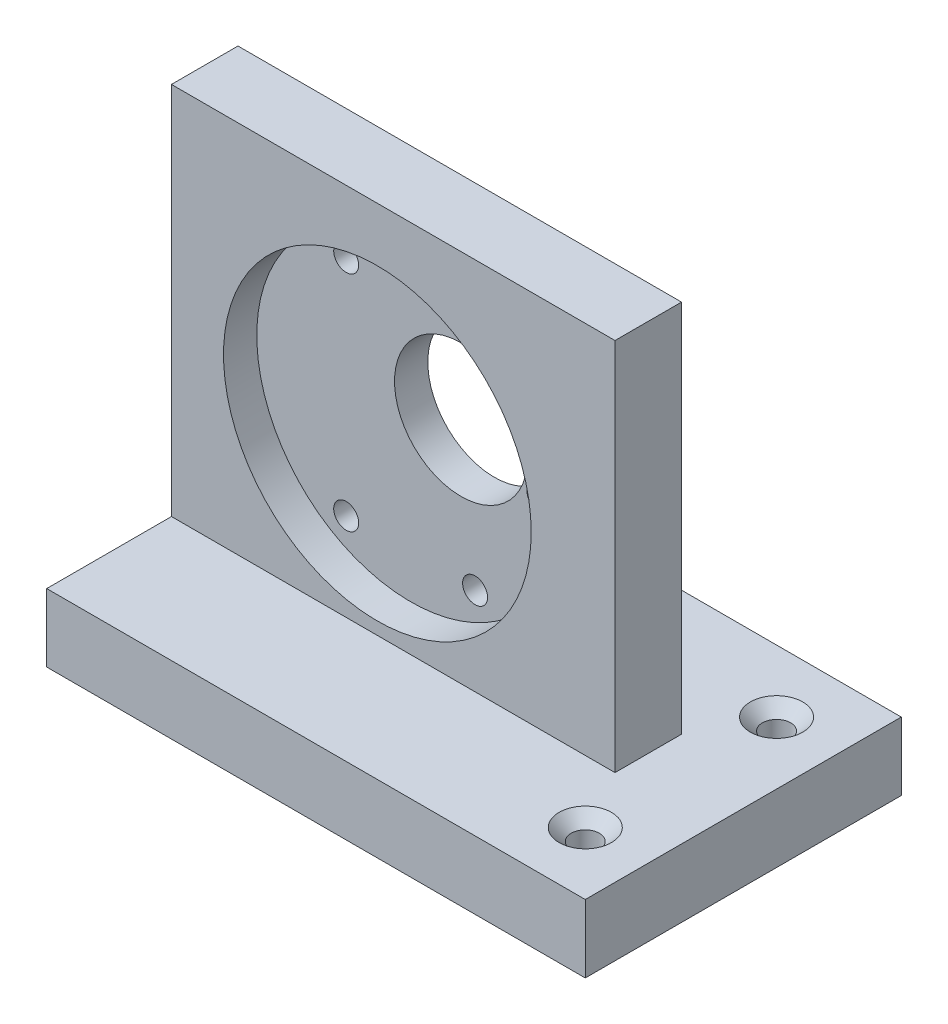
ISO-10303-21;
HEADER;
FILE_DESCRIPTION(('STEP AP214'),'2;1');
FILE_NAME('part.step','',(''),(''),'','','');
FILE_SCHEMA(('AUTOMOTIVE_DESIGN { 1 0 10303 214 1 1 1 1 }'));
ENDSEC;
DATA;
#1=APPLICATION_CONTEXT('core data for automotive mechanical design processes');
#2=APPLICATION_PROTOCOL_DEFINITION('international standard','automotive_design',2000,#1);
#3=PRODUCT_CONTEXT('',#1,'mechanical');
#4=PRODUCT('Part','Part','',(#3));
#5=PRODUCT_RELATED_PRODUCT_CATEGORY('part','',(#4));
#6=PRODUCT_DEFINITION_FORMATION('','',#4);
#7=PRODUCT_DEFINITION_CONTEXT('part definition',#1,'design');
#8=PRODUCT_DEFINITION('design','',#6,#7);
#9=PRODUCT_DEFINITION_SHAPE('','',#8);
#10=(LENGTH_UNIT() NAMED_UNIT(*) SI_UNIT(.MILLI.,.METRE.));
#11=(NAMED_UNIT(*) PLANE_ANGLE_UNIT() SI_UNIT($,.RADIAN.));
#12=(NAMED_UNIT(*) SI_UNIT($,.STERADIAN.) SOLID_ANGLE_UNIT());
#13=UNCERTAINTY_MEASURE_WITH_UNIT(LENGTH_MEASURE(1.E-05),#10,'distance_accuracy_value','');
#14=(GEOMETRIC_REPRESENTATION_CONTEXT(3) GLOBAL_UNCERTAINTY_ASSIGNED_CONTEXT((#13)) GLOBAL_UNIT_ASSIGNED_CONTEXT((#10,
#11,#12)) REPRESENTATION_CONTEXT('',''));
#15=CARTESIAN_POINT('',(0.,0.,0.));
#16=DIRECTION('',(0.,0.,1.));
#17=DIRECTION('',(1.,0.,0.));
#18=AXIS2_PLACEMENT_3D('',#15,#16,#17);
#19=CARTESIAN_POINT('',(-40.,5.,23.));
#20=DIRECTION('',(0.,-1.,0.));
#21=DIRECTION('',(1.,0.,0.));
#22=AXIS2_PLACEMENT_3D('',#19,#20,#21);
#23=PLANE('',#22);
#24=CARTESIAN_POINT('',(32.5,5.00000000000002,-7.5));
#25=DIRECTION('',(0.,1.,0.));
#26=DIRECTION('',(0.,0.,1.));
#27=AXIS2_PLACEMENT_3D('',#24,#25,#26);
#28=CIRCLE('',#27,3.15);
#29=CARTESIAN_POINT('',(32.5,5.00000000000002,-4.35));
#30=VERTEX_POINT('',#29);
#31=EDGE_CURVE('E183',#30,#30,#28,.T.);
#32=ORIENTED_EDGE('',*,*,#31,.F.);
#33=EDGE_LOOP('',(#32));
#34=FACE_BOUND('',#33,.T.);
#35=CARTESIAN_POINT('',(32.5,5.00000000000002,15.5));
#36=DIRECTION('',(0.,1.,0.));
#37=DIRECTION('',(0.,0.,1.));
#38=AXIS2_PLACEMENT_3D('',#35,#36,#37);
#39=CIRCLE('',#38,3.15);
#40=CARTESIAN_POINT('',(32.5,5.00000000000002,18.65));
#41=VERTEX_POINT('',#40);
#42=EDGE_CURVE('E175',#41,#41,#39,.T.);
#43=ORIENTED_EDGE('',*,*,#42,.F.);
#44=EDGE_LOOP('',(#43));
#45=FACE_BOUND('',#44,.T.);
#46=DIRECTION('',(0.,0.,-1.));
#47=VECTOR('',#46,1.);
#48=CARTESIAN_POINT('',(-24.76,5.,23.));
#49=LINE('',#48,#47);
#50=CARTESIAN_POINT('',(-24.76,5.00000000000002,23.));
#51=VERTEX_POINT('',#50);
#52=CARTESIAN_POINT('',(-24.76,5.,8.));
#53=VERTEX_POINT('',#52);
#54=EDGE_CURVE('E172',#51,#53,#49,.T.);
#55=ORIENTED_EDGE('',*,*,#54,.F.);
#56=DIRECTION('',(-1.,0.,0.));
#57=VECTOR('',#56,1.);
#58=CARTESIAN_POINT('',(-40.,5.,23.));
#59=LINE('',#58,#57);
#60=CARTESIAN_POINT('',(40.,5.00000000000002,23.));
#61=VERTEX_POINT('',#60);
#62=EDGE_CURVE('E123',#61,#51,#59,.T.);
#63=ORIENTED_EDGE('',*,*,#62,.F.);
#64=DIRECTION('',(0.,0.,-1.));
#65=VECTOR('',#64,1.);
#66=CARTESIAN_POINT('',(40.,5.00000000000002,23.));
#67=LINE('',#66,#65);
#68=CARTESIAN_POINT('',(40.,5.00000000000002,-15.));
#69=VERTEX_POINT('',#68);
#70=EDGE_CURVE('E204',#61,#69,#67,.T.);
#71=ORIENTED_EDGE('',*,*,#70,.T.);
#72=DIRECTION('',(-1.,0.,0.));
#73=VECTOR('',#72,1.);
#74=CARTESIAN_POINT('',(-40.,5.,-15.));
#75=LINE('',#74,#73);
#76=CARTESIAN_POINT('',(-24.76,5.00000000000002,-15.));
#77=VERTEX_POINT('',#76);
#78=EDGE_CURVE('E195',#69,#77,#75,.T.);
#79=ORIENTED_EDGE('',*,*,#78,.T.);
#80=CARTESIAN_POINT('',(-24.76,5.,0.));
#81=VERTEX_POINT('',#80);
#82=EDGE_CURVE('E168',#81,#77,#49,.T.);
#83=ORIENTED_EDGE('',*,*,#82,.F.);
#84=DIRECTION('',(-1.,0.,0.));
#85=VECTOR('',#84,1.);
#86=CARTESIAN_POINT('',(0.,5.00000000000001,0.));
#87=LINE('',#86,#85);
#88=CARTESIAN_POINT('',(28.575,5.00000000000001,0.));
#89=VERTEX_POINT('',#88);
#90=EDGE_CURVE('E12',#89,#81,#87,.T.);
#91=ORIENTED_EDGE('',*,*,#90,.F.);
#92=DIRECTION('',(0.,0.,-1.));
#93=VECTOR('',#92,1.);
#94=CARTESIAN_POINT('',(28.575,5.00000000000001,8.));
#95=LINE('',#94,#93);
#96=CARTESIAN_POINT('',(28.575,5.00000000000001,8.));
#97=VERTEX_POINT('',#96);
#98=EDGE_CURVE('E207',#97,#89,#95,.T.);
#99=ORIENTED_EDGE('',*,*,#98,.F.);
#100=DIRECTION('',(-1.,0.,0.));
#101=VECTOR('',#100,1.);
#102=CARTESIAN_POINT('',(0.,5.00000000000001,8.));
#103=LINE('',#102,#101);
#104=EDGE_CURVE('E211',#97,#53,#103,.T.);
#105=ORIENTED_EDGE('',*,*,#104,.T.);
#106=EDGE_LOOP('',(#55,#63,#71,#79,#83,#91,#99,#105));
#107=FACE_BOUND('',#106,.T.);
#108=ADVANCED_FACE('F53',(#34,#45,#107),#23,.F.);
#109=CARTESIAN_POINT('',(0.,0.,8.));
#110=DIRECTION('',(0.,0.,-1.));
#111=DIRECTION('',(-1.,0.,0.));
#112=AXIS2_PLACEMENT_3D('',#109,#110,#111);
#113=PLANE('',#112);
#114=CARTESIAN_POINT('',(0.,25.,8.));
#115=DIRECTION('',(0.,0.,1.));
#116=DIRECTION('',(1.,0.,0.));
#117=AXIS2_PLACEMENT_3D('',#114,#115,#116);
#118=CIRCLE('',#117,18.5);
#119=CARTESIAN_POINT('',(18.5,25.,8.));
#120=VERTEX_POINT('',#119);
#121=EDGE_CURVE('E215',#120,#120,#118,.T.);
#122=ORIENTED_EDGE('',*,*,#121,.F.);
#123=EDGE_LOOP('',(#122));
#124=FACE_BOUND('',#123,.T.);
#125=DIRECTION('',(0.,1.,0.));
#126=VECTOR('',#125,1.);
#127=CARTESIAN_POINT('',(-24.76,0.,8.));
#128=LINE('',#127,#126);
#129=CARTESIAN_POINT('',(-24.76,50.,8.));
#130=VERTEX_POINT('',#129);
#131=EDGE_CURVE('E171',#53,#130,#128,.T.);
#132=ORIENTED_EDGE('',*,*,#131,.F.);
#133=ORIENTED_EDGE('',*,*,#104,.F.);
#134=DIRECTION('',(0.,-1.,0.));
#135=VECTOR('',#134,1.);
#136=CARTESIAN_POINT('',(28.575,50.,8.));
#137=LINE('',#136,#135);
#138=CARTESIAN_POINT('',(28.575,50.,8.));
#139=VERTEX_POINT('',#138);
#140=EDGE_CURVE('E271',#139,#97,#137,.T.);
#141=ORIENTED_EDGE('',*,*,#140,.F.);
#142=DIRECTION('',(1.,0.,0.));
#143=VECTOR('',#142,1.);
#144=CARTESIAN_POINT('',(-28.575,50.,8.));
#145=LINE('',#144,#143);
#146=EDGE_CURVE('E69',#130,#139,#145,.T.);
#147=ORIENTED_EDGE('',*,*,#146,.F.);
#148=EDGE_LOOP('',(#132,#133,#141,#147));
#149=FACE_BOUND('',#148,.T.);
#150=ADVANCED_FACE('F302',(#124,#149),#113,.F.);
#151=CARTESIAN_POINT('',(0.,0.,0.));
#152=DIRECTION('',(0.,0.,-1.));
#153=DIRECTION('',(-1.,0.,0.));
#154=AXIS2_PLACEMENT_3D('',#151,#152,#153);
#155=PLANE('',#154);
#156=CARTESIAN_POINT('',(-7.74999999999999,38.4233937586588,0.));
#157=DIRECTION('',(0.,0.,1.));
#158=DIRECTION('',(1.,0.,0.));
#159=AXIS2_PLACEMENT_3D('',#156,#157,#158);
#160=CIRCLE('',#159,1.50000000039213);
#161=CARTESIAN_POINT('',(-6.24999999960786,38.4233937586588,0.));
#162=VERTEX_POINT('',#161);
#163=EDGE_CURVE('E249',#162,#162,#160,.T.);
#164=ORIENTED_EDGE('',*,*,#163,.T.);
#165=EDGE_LOOP('',(#164));
#166=FACE_BOUND('',#165,.T.);
#167=CARTESIAN_POINT('',(-7.74999999999999,11.5766062413412,0.));
#168=DIRECTION('',(0.,0.,1.));
#169=DIRECTION('',(1.,0.,0.));
#170=AXIS2_PLACEMENT_3D('',#167,#168,#169);
#171=CIRCLE('',#170,1.50000000039213);
#172=CARTESIAN_POINT('',(-6.24999999960786,11.5766062413412,0.));
#173=VERTEX_POINT('',#172);
#174=EDGE_CURVE('E254',#173,#173,#171,.T.);
#175=ORIENTED_EDGE('',*,*,#174,.T.);
#176=EDGE_LOOP('',(#175));
#177=FACE_BOUND('',#176,.T.);
#178=CARTESIAN_POINT('',(7.75000000000001,11.5766062413412,0.));
#179=DIRECTION('',(0.,0.,1.));
#180=DIRECTION('',(1.,0.,0.));
#181=AXIS2_PLACEMENT_3D('',#178,#179,#180);
#182=CIRCLE('',#181,1.50000000039213);
#183=CARTESIAN_POINT('',(9.25000000039214,11.5766062413412,0.));
#184=VERTEX_POINT('',#183);
#185=EDGE_CURVE('E258',#184,#184,#182,.T.);
#186=ORIENTED_EDGE('',*,*,#185,.T.);
#187=EDGE_LOOP('',(#186));
#188=FACE_BOUND('',#187,.T.);
#189=CARTESIAN_POINT('',(15.5,25.,0.));
#190=DIRECTION('',(0.,0.,1.));
#191=DIRECTION('',(1.,0.,0.));
#192=AXIS2_PLACEMENT_3D('',#189,#190,#191);
#193=CIRCLE('',#192,1.50000000039213);
#194=CARTESIAN_POINT('',(17.0000000003921,25.,0.));
#195=VERTEX_POINT('',#194);
#196=EDGE_CURVE('E248',#195,#195,#193,.T.);
#197=ORIENTED_EDGE('',*,*,#196,.T.);
#198=EDGE_LOOP('',(#197));
#199=FACE_BOUND('',#198,.T.);
#200=CARTESIAN_POINT('',(6.06217782532956,28.4999999993294,0.));
#201=DIRECTION('',(0.,0.,1.));
#202=DIRECTION('',(1.,0.,0.));
#203=AXIS2_PLACEMENT_3D('',#200,#201,#202);
#204=CIRCLE('',#203,8.00000000000001);
#205=CARTESIAN_POINT('',(14.0621778253296,28.4999999993294,0.));
#206=VERTEX_POINT('',#205);
#207=EDGE_CURVE('E244',#206,#206,#204,.T.);
#208=ORIENTED_EDGE('',*,*,#207,.T.);
#209=EDGE_LOOP('',(#208));
#210=FACE_BOUND('',#209,.T.);
#211=CARTESIAN_POINT('',(7.74999999999999,38.4233937586588,0.));
#212=DIRECTION('',(0.,0.,1.));
#213=DIRECTION('',(1.,0.,0.));
#214=AXIS2_PLACEMENT_3D('',#211,#212,#213);
#215=CIRCLE('',#214,1.50000000039214);
#216=CARTESIAN_POINT('',(9.25000000039213,38.4233937586588,0.));
#217=VERTEX_POINT('',#216);
#218=EDGE_CURVE('E253',#217,#217,#215,.T.);
#219=ORIENTED_EDGE('',*,*,#218,.T.);
#220=EDGE_LOOP('',(#219));
#221=FACE_BOUND('',#220,.T.);
#222=ORIENTED_EDGE('',*,*,#90,.T.);
#223=DIRECTION('',(0.,1.,0.));
#224=VECTOR('',#223,1.);
#225=CARTESIAN_POINT('',(-24.76,0.,0.));
#226=LINE('',#225,#224);
#227=CARTESIAN_POINT('',(-24.76,50.,0.));
#228=VERTEX_POINT('',#227);
#229=EDGE_CURVE('E127',#81,#228,#226,.T.);
#230=ORIENTED_EDGE('',*,*,#229,.T.);
#231=DIRECTION('',(1.,0.,0.));
#232=VECTOR('',#231,1.);
#233=CARTESIAN_POINT('',(-28.575,50.,0.));
#234=LINE('',#233,#232);
#235=CARTESIAN_POINT('',(28.575,50.,0.));
#236=VERTEX_POINT('',#235);
#237=EDGE_CURVE('E268',#228,#236,#234,.T.);
#238=ORIENTED_EDGE('',*,*,#237,.T.);
#239=DIRECTION('',(0.,-1.,0.));
#240=VECTOR('',#239,1.);
#241=CARTESIAN_POINT('',(28.575,50.,0.));
#242=LINE('',#241,#240);
#243=EDGE_CURVE('E272',#236,#89,#242,.T.);
#244=ORIENTED_EDGE('',*,*,#243,.T.);
#245=EDGE_LOOP('',(#222,#230,#238,#244));
#246=FACE_BOUND('',#245,.T.);
#247=ADVANCED_FACE('F305',(#166,#177,#188,#199,#210,#221,#246),#155,.T.);
#248=CARTESIAN_POINT('',(-28.575,50.,8.));
#249=DIRECTION('',(0.,1.,0.));
#250=DIRECTION('',(-1.,0.,0.));
#251=AXIS2_PLACEMENT_3D('',#248,#249,#250);
#252=PLANE('',#251);
#253=ORIENTED_EDGE('',*,*,#237,.F.);
#254=DIRECTION('',(0.,0.,-1.));
#255=VECTOR('',#254,1.);
#256=CARTESIAN_POINT('',(-24.76,50.,-15.));
#257=LINE('',#256,#255);
#258=EDGE_CURVE('E160',#130,#228,#257,.T.);
#259=ORIENTED_EDGE('',*,*,#258,.F.);
#260=ORIENTED_EDGE('',*,*,#146,.T.);
#261=DIRECTION('',(0.,0.,-1.));
#262=VECTOR('',#261,1.);
#263=CARTESIAN_POINT('',(28.575,50.,8.));
#264=LINE('',#263,#262);
#265=EDGE_CURVE('E63',#139,#236,#264,.T.);
#266=ORIENTED_EDGE('',*,*,#265,.T.);
#267=EDGE_LOOP('',(#253,#259,#260,#266));
#268=FACE_BOUND('',#267,.T.);
#269=ADVANCED_FACE('F55',(#268),#252,.T.);
#270=CARTESIAN_POINT('',(0.,0.,23.));
#271=DIRECTION('',(0.,0.,1.));
#272=DIRECTION('',(1.,0.,0.));
#273=AXIS2_PLACEMENT_3D('',#270,#271,#272);
#274=PLANE('',#273);
#275=ORIENTED_EDGE('',*,*,#62,.T.);
#276=DIRECTION('',(0.,-1.,0.));
#277=VECTOR('',#276,1.);
#278=CARTESIAN_POINT('',(-24.76,50.,23.));
#279=LINE('',#278,#277);
#280=CARTESIAN_POINT('',(-24.76,-3.175,23.));
#281=VERTEX_POINT('',#280);
#282=EDGE_CURVE('E117',#51,#281,#279,.T.);
#283=ORIENTED_EDGE('',*,*,#282,.T.);
#284=DIRECTION('',(-1.,0.,0.));
#285=VECTOR('',#284,1.);
#286=CARTESIAN_POINT('',(0.,-3.175,23.));
#287=LINE('',#286,#285);
#288=CARTESIAN_POINT('',(40.,-3.17499999999999,23.));
#289=VERTEX_POINT('',#288);
#290=EDGE_CURVE('E121',#289,#281,#287,.T.);
#291=ORIENTED_EDGE('',*,*,#290,.F.);
#292=DIRECTION('',(0.,1.,0.));
#293=VECTOR('',#292,1.);
#294=CARTESIAN_POINT('',(40.,5.00000000000002,23.));
#295=LINE('',#294,#293);
#296=EDGE_CURVE('E199',#289,#61,#295,.T.);
#297=ORIENTED_EDGE('',*,*,#296,.T.);
#298=EDGE_LOOP('',(#275,#283,#291,#297));
#299=FACE_BOUND('',#298,.T.);
#300=ADVANCED_FACE('F119',(#299),#274,.T.);
#301=CARTESIAN_POINT('',(0.,0.,-15.));
#302=DIRECTION('',(0.,0.,1.));
#303=DIRECTION('',(1.,0.,0.));
#304=AXIS2_PLACEMENT_3D('',#301,#302,#303);
#305=PLANE('',#304);
#306=DIRECTION('',(0.,-1.,0.));
#307=VECTOR('',#306,1.);
#308=CARTESIAN_POINT('',(-24.76,50.,-15.));
#309=LINE('',#308,#307);
#310=CARTESIAN_POINT('',(-24.76,-3.175,-15.));
#311=VERTEX_POINT('',#310);
#312=EDGE_CURVE('E128',#77,#311,#309,.T.);
#313=ORIENTED_EDGE('',*,*,#312,.F.);
#314=ORIENTED_EDGE('',*,*,#78,.F.);
#315=DIRECTION('',(0.,1.,0.));
#316=VECTOR('',#315,1.);
#317=CARTESIAN_POINT('',(40.,5.00000000000002,-15.));
#318=LINE('',#317,#316);
#319=CARTESIAN_POINT('',(40.,-3.17499999999999,-15.));
#320=VERTEX_POINT('',#319);
#321=EDGE_CURVE('E191',#320,#69,#318,.T.);
#322=ORIENTED_EDGE('',*,*,#321,.F.);
#323=DIRECTION('',(1.,0.,0.));
#324=VECTOR('',#323,1.);
#325=CARTESIAN_POINT('',(0.,-3.175,-15.));
#326=LINE('',#325,#324);
#327=EDGE_CURVE('E138',#311,#320,#326,.T.);
#328=ORIENTED_EDGE('',*,*,#327,.F.);
#329=EDGE_LOOP('',(#313,#314,#322,#328));
#330=FACE_BOUND('',#329,.T.);
#331=ADVANCED_FACE('F323',(#330),#305,.F.);
#332=CARTESIAN_POINT('',(28.575,50.,8.));
#333=DIRECTION('',(1.,0.,0.));
#334=DIRECTION('',(0.,1.,0.));
#335=AXIS2_PLACEMENT_3D('',#332,#333,#334);
#336=PLANE('',#335);
#337=ORIENTED_EDGE('',*,*,#140,.T.);
#338=ORIENTED_EDGE('',*,*,#98,.T.);
#339=ORIENTED_EDGE('',*,*,#243,.F.);
#340=ORIENTED_EDGE('',*,*,#265,.F.);
#341=EDGE_LOOP('',(#337,#338,#339,#340));
#342=FACE_BOUND('',#341,.T.);
#343=ADVANCED_FACE('F314',(#342),#336,.T.);
#344=CARTESIAN_POINT('',(7.74999999999999,38.4233937586588,10.));
#345=DIRECTION('',(0.,0.,-1.));
#346=DIRECTION('',(-1.,0.,0.));
#347=AXIS2_PLACEMENT_3D('',#344,#345,#346);
#348=CYLINDRICAL_SURFACE('',#347,1.50000000039214);
#349=ORIENTED_EDGE('',*,*,#218,.F.);
#350=EDGE_LOOP('',(#349));
#351=FACE_BOUND('',#350,.T.);
#352=CARTESIAN_POINT('',(7.74999999999999,38.4233937586588,4.));
#353=DIRECTION('',(0.,0.,1.));
#354=DIRECTION('',(1.,0.,0.));
#355=AXIS2_PLACEMENT_3D('',#352,#353,#354);
#356=CIRCLE('',#355,1.50000000039214);
#357=CARTESIAN_POINT('',(9.25000000039213,38.4233937586588,4.));
#358=VERTEX_POINT('',#357);
#359=EDGE_CURVE('E240',#358,#358,#356,.T.);
#360=ORIENTED_EDGE('',*,*,#359,.T.);
#361=EDGE_LOOP('',(#360));
#362=FACE_BOUND('',#361,.T.);
#363=ADVANCED_FACE('F344',(#351,#362),#348,.F.);
#364=CARTESIAN_POINT('',(6.06217782532956,28.4999999993294,10.));
#365=DIRECTION('',(0.,0.,-1.));
#366=DIRECTION('',(-1.,0.,0.));
#367=AXIS2_PLACEMENT_3D('',#364,#365,#366);
#368=CYLINDRICAL_SURFACE('',#367,8.00000000000001);
#369=ORIENTED_EDGE('',*,*,#207,.F.);
#370=EDGE_LOOP('',(#369));
#371=FACE_BOUND('',#370,.T.);
#372=CARTESIAN_POINT('',(6.06217782532956,28.4999999993294,4.));
#373=DIRECTION('',(0.,0.,1.));
#374=DIRECTION('',(1.,0.,0.));
#375=AXIS2_PLACEMENT_3D('',#372,#373,#374);
#376=CIRCLE('',#375,8.00000000000001);
#377=CARTESIAN_POINT('',(14.0621778253296,28.4999999993294,4.));
#378=VERTEX_POINT('',#377);
#379=EDGE_CURVE('E236',#378,#378,#376,.T.);
#380=ORIENTED_EDGE('',*,*,#379,.T.);
#381=EDGE_LOOP('',(#380));
#382=FACE_BOUND('',#381,.T.);
#383=ADVANCED_FACE('F340',(#371,#382),#368,.F.);
#384=CARTESIAN_POINT('',(15.5,25.,10.));
#385=DIRECTION('',(0.,0.,-1.));
#386=DIRECTION('',(-1.,0.,0.));
#387=AXIS2_PLACEMENT_3D('',#384,#385,#386);
#388=CYLINDRICAL_SURFACE('',#387,1.50000000039213);
#389=ORIENTED_EDGE('',*,*,#196,.F.);
#390=EDGE_LOOP('',(#389));
#391=FACE_BOUND('',#390,.T.);
#392=CARTESIAN_POINT('',(15.5,25.,4.));
#393=DIRECTION('',(0.,0.,1.));
#394=DIRECTION('',(1.,0.,0.));
#395=AXIS2_PLACEMENT_3D('',#392,#393,#394);
#396=CIRCLE('',#395,1.50000000039213);
#397=CARTESIAN_POINT('',(17.0000000003921,25.,4.));
#398=VERTEX_POINT('',#397);
#399=EDGE_CURVE('E232',#398,#398,#396,.T.);
#400=ORIENTED_EDGE('',*,*,#399,.T.);
#401=EDGE_LOOP('',(#400));
#402=FACE_BOUND('',#401,.T.);
#403=ADVANCED_FACE('F343',(#391,#402),#388,.F.);
#404=CARTESIAN_POINT('',(7.75000000000001,11.5766062413412,10.));
#405=DIRECTION('',(0.,0.,-1.));
#406=DIRECTION('',(-1.,0.,0.));
#407=AXIS2_PLACEMENT_3D('',#404,#405,#406);
#408=CYLINDRICAL_SURFACE('',#407,1.50000000039213);
#409=ORIENTED_EDGE('',*,*,#185,.F.);
#410=EDGE_LOOP('',(#409));
#411=FACE_BOUND('',#410,.T.);
#412=CARTESIAN_POINT('',(7.75000000000001,11.5766062413412,4.));
#413=DIRECTION('',(0.,0.,1.));
#414=DIRECTION('',(1.,0.,0.));
#415=AXIS2_PLACEMENT_3D('',#412,#413,#414);
#416=CIRCLE('',#415,1.50000000039213);
#417=CARTESIAN_POINT('',(9.25000000039214,11.5766062413412,4.));
#418=VERTEX_POINT('',#417);
#419=EDGE_CURVE('E228',#418,#418,#416,.T.);
#420=ORIENTED_EDGE('',*,*,#419,.T.);
#421=EDGE_LOOP('',(#420));
#422=FACE_BOUND('',#421,.T.);
#423=ADVANCED_FACE('F352',(#411,#422),#408,.F.);
#424=CARTESIAN_POINT('',(-7.74999999999999,11.5766062413412,10.));
#425=DIRECTION('',(0.,0.,-1.));
#426=DIRECTION('',(-1.,0.,0.));
#427=AXIS2_PLACEMENT_3D('',#424,#425,#426);
#428=CYLINDRICAL_SURFACE('',#427,1.50000000039213);
#429=ORIENTED_EDGE('',*,*,#174,.F.);
#430=EDGE_LOOP('',(#429));
#431=FACE_BOUND('',#430,.T.);
#432=CARTESIAN_POINT('',(-7.74999999999999,11.5766062413412,4.));
#433=DIRECTION('',(0.,0.,1.));
#434=DIRECTION('',(1.,0.,0.));
#435=AXIS2_PLACEMENT_3D('',#432,#433,#434);
#436=CIRCLE('',#435,1.50000000039213);
#437=CARTESIAN_POINT('',(-6.24999999960786,11.5766062413412,4.));
#438=VERTEX_POINT('',#437);
#439=EDGE_CURVE('E224',#438,#438,#436,.T.);
#440=ORIENTED_EDGE('',*,*,#439,.T.);
#441=EDGE_LOOP('',(#440));
#442=FACE_BOUND('',#441,.T.);
#443=ADVANCED_FACE('F348',(#431,#442),#428,.F.);
#444=CARTESIAN_POINT('',(-7.74999999999999,38.4233937586588,10.));
#445=DIRECTION('',(0.,0.,-1.));
#446=DIRECTION('',(-1.,0.,0.));
#447=AXIS2_PLACEMENT_3D('',#444,#445,#446);
#448=CYLINDRICAL_SURFACE('',#447,1.50000000039213);
#449=ORIENTED_EDGE('',*,*,#163,.F.);
#450=EDGE_LOOP('',(#449));
#451=FACE_BOUND('',#450,.T.);
#452=CARTESIAN_POINT('',(-7.74999999999999,38.4233937586588,4.));
#453=DIRECTION('',(0.,0.,1.));
#454=DIRECTION('',(1.,0.,0.));
#455=AXIS2_PLACEMENT_3D('',#452,#453,#454);
#456=CIRCLE('',#455,1.50000000039213);
#457=CARTESIAN_POINT('',(-6.24999999960786,38.4233937586588,4.));
#458=VERTEX_POINT('',#457);
#459=EDGE_CURVE('E220',#458,#458,#456,.T.);
#460=ORIENTED_EDGE('',*,*,#459,.T.);
#461=EDGE_LOOP('',(#460));
#462=FACE_BOUND('',#461,.T.);
#463=ADVANCED_FACE('F286',(#451,#462),#448,.F.);
#464=CARTESIAN_POINT('',(0.,25.,4.));
#465=DIRECTION('',(0.,0.,1.));
#466=DIRECTION('',(1.,0.,0.));
#467=AXIS2_PLACEMENT_3D('',#464,#465,#466);
#468=CYLINDRICAL_SURFACE('',#467,18.5);
#469=CARTESIAN_POINT('',(0.,25.,4.));
#470=DIRECTION('',(0.,0.,1.));
#471=DIRECTION('',(1.,0.,0.));
#472=AXIS2_PLACEMENT_3D('',#469,#470,#471);
#473=CIRCLE('',#472,18.5);
#474=CARTESIAN_POINT('',(18.5,25.,4.));
#475=VERTEX_POINT('',#474);
#476=EDGE_CURVE('E216',#475,#475,#473,.T.);
#477=ORIENTED_EDGE('',*,*,#476,.F.);
#478=EDGE_LOOP('',(#477));
#479=FACE_BOUND('',#478,.T.);
#480=ORIENTED_EDGE('',*,*,#121,.T.);
#481=EDGE_LOOP('',(#480));
#482=FACE_BOUND('',#481,.T.);
#483=ADVANCED_FACE('F292',(#479,#482),#468,.F.);
#484=CARTESIAN_POINT('',(0.,25.,4.));
#485=DIRECTION('',(0.,0.,1.));
#486=DIRECTION('',(1.,0.,0.));
#487=AXIS2_PLACEMENT_3D('',#484,#485,#486);
#488=PLANE('',#487);
#489=ORIENTED_EDGE('',*,*,#359,.F.);
#490=EDGE_LOOP('',(#489));
#491=FACE_BOUND('',#490,.T.);
#492=ORIENTED_EDGE('',*,*,#379,.F.);
#493=EDGE_LOOP('',(#492));
#494=FACE_BOUND('',#493,.T.);
#495=ORIENTED_EDGE('',*,*,#399,.F.);
#496=EDGE_LOOP('',(#495));
#497=FACE_BOUND('',#496,.T.);
#498=ORIENTED_EDGE('',*,*,#419,.F.);
#499=EDGE_LOOP('',(#498));
#500=FACE_BOUND('',#499,.T.);
#501=ORIENTED_EDGE('',*,*,#439,.F.);
#502=EDGE_LOOP('',(#501));
#503=FACE_BOUND('',#502,.T.);
#504=ORIENTED_EDGE('',*,*,#459,.F.);
#505=EDGE_LOOP('',(#504));
#506=FACE_BOUND('',#505,.T.);
#507=ORIENTED_EDGE('',*,*,#476,.T.);
#508=EDGE_LOOP('',(#507));
#509=FACE_BOUND('',#508,.T.);
#510=ADVANCED_FACE('F288',(#491,#494,#497,#500,#503,#506,#509),#488,.T.);
#511=CARTESIAN_POINT('',(40.,5.00000000000002,23.));
#512=DIRECTION('',(-1.,0.,0.));
#513=DIRECTION('',(0.,0.,1.));
#514=AXIS2_PLACEMENT_3D('',#511,#512,#513);
#515=PLANE('',#514);
#516=ORIENTED_EDGE('',*,*,#296,.F.);
#517=DIRECTION('',(0.,0.,1.));
#518=VECTOR('',#517,1.);
#519=CARTESIAN_POINT('',(40.,-3.17499999999999,0.));
#520=LINE('',#519,#518);
#521=EDGE_CURVE('E144',#320,#289,#520,.T.);
#522=ORIENTED_EDGE('',*,*,#521,.F.);
#523=ORIENTED_EDGE('',*,*,#321,.T.);
#524=ORIENTED_EDGE('',*,*,#70,.F.);
#525=EDGE_LOOP('',(#516,#522,#523,#524));
#526=FACE_BOUND('',#525,.T.);
#527=ADVANCED_FACE('F291',(#526),#515,.F.);
#528=CARTESIAN_POINT('',(32.5,5.00000000000001,-7.5));
#529=DIRECTION('',(0.,1.,0.));
#530=DIRECTION('',(0.,0.,1.));
#531=AXIS2_PLACEMENT_3D('',#528,#529,#530);
#532=CYLINDRICAL_SURFACE('',#531,1.69999999999999);
#533=CARTESIAN_POINT('',(32.5,3.55000000000001,-7.5));
#534=DIRECTION('',(0.,1.,0.));
#535=DIRECTION('',(0.,0.,1.));
#536=AXIS2_PLACEMENT_3D('',#533,#534,#535);
#537=CIRCLE('',#536,1.69999999999999);
#538=CARTESIAN_POINT('',(32.5,3.55000000000001,-5.80000000000001));
#539=VERTEX_POINT('',#538);
#540=EDGE_CURVE('E187',#539,#539,#537,.T.);
#541=ORIENTED_EDGE('',*,*,#540,.T.);
#542=EDGE_LOOP('',(#541));
#543=FACE_BOUND('',#542,.T.);
#544=CARTESIAN_POINT('',(32.5,-3.17499999999999,-7.5));
#545=DIRECTION('',(0.,-1.,0.));
#546=DIRECTION('',(1.,0.,0.));
#547=AXIS2_PLACEMENT_3D('',#544,#545,#546);
#548=CIRCLE('',#547,1.69999999999999);
#549=CARTESIAN_POINT('',(34.2,-3.17499999999999,-7.5));
#550=VERTEX_POINT('',#549);
#551=EDGE_CURVE('E156',#550,#550,#548,.F.);
#552=ORIENTED_EDGE('',*,*,#551,.F.);
#553=EDGE_LOOP('',(#552));
#554=FACE_BOUND('',#553,.T.);
#555=ADVANCED_FACE('F337',(#543,#554),#532,.F.);
#556=CARTESIAN_POINT('',(32.5,5.00000000000002,-7.5));
#557=DIRECTION('',(0.,1.,0.));
#558=DIRECTION('',(0.,0.,1.));
#559=AXIS2_PLACEMENT_3D('',#556,#557,#558);
#560=CONICAL_SURFACE('',#559,3.15,0.78539816339745);
#561=ORIENTED_EDGE('',*,*,#540,.F.);
#562=EDGE_LOOP('',(#561));
#563=FACE_BOUND('',#562,.T.);
#564=ORIENTED_EDGE('',*,*,#31,.T.);
#565=EDGE_LOOP('',(#564));
#566=FACE_BOUND('',#565,.T.);
#567=ADVANCED_FACE('F371',(#563,#566),#560,.F.);
#568=CARTESIAN_POINT('',(32.5,5.00000000000001,15.5));
#569=DIRECTION('',(0.,1.,0.));
#570=DIRECTION('',(0.,0.,1.));
#571=AXIS2_PLACEMENT_3D('',#568,#569,#570);
#572=CYLINDRICAL_SURFACE('',#571,1.69999999999999);
#573=CARTESIAN_POINT('',(32.5,3.55000000000001,15.5));
#574=DIRECTION('',(0.,1.,0.));
#575=DIRECTION('',(0.,0.,1.));
#576=AXIS2_PLACEMENT_3D('',#573,#574,#575);
#577=CIRCLE('',#576,1.69999999999999);
#578=CARTESIAN_POINT('',(32.5,3.55000000000001,17.2));
#579=VERTEX_POINT('',#578);
#580=EDGE_CURVE('E179',#579,#579,#577,.T.);
#581=ORIENTED_EDGE('',*,*,#580,.T.);
#582=EDGE_LOOP('',(#581));
#583=FACE_BOUND('',#582,.T.);
#584=CARTESIAN_POINT('',(32.5,-3.17499999999999,15.5));
#585=DIRECTION('',(0.,-1.,0.));
#586=DIRECTION('',(1.,0.,0.));
#587=AXIS2_PLACEMENT_3D('',#584,#585,#586);
#588=CIRCLE('',#587,1.69999999999999);
#589=CARTESIAN_POINT('',(34.2,-3.17499999999999,15.5));
#590=VERTEX_POINT('',#589);
#591=EDGE_CURVE('E146',#590,#590,#588,.F.);
#592=ORIENTED_EDGE('',*,*,#591,.F.);
#593=EDGE_LOOP('',(#592));
#594=FACE_BOUND('',#593,.T.);
#595=ADVANCED_FACE('F375',(#583,#594),#572,.F.);
#596=CARTESIAN_POINT('',(32.5,5.00000000000002,15.5));
#597=DIRECTION('',(0.,1.,0.));
#598=DIRECTION('',(0.,0.,1.));
#599=AXIS2_PLACEMENT_3D('',#596,#597,#598);
#600=CONICAL_SURFACE('',#599,3.15,0.78539816339745);
#601=ORIENTED_EDGE('',*,*,#580,.F.);
#602=EDGE_LOOP('',(#601));
#603=FACE_BOUND('',#602,.T.);
#604=ORIENTED_EDGE('',*,*,#42,.T.);
#605=EDGE_LOOP('',(#604));
#606=FACE_BOUND('',#605,.T.);
#607=ADVANCED_FACE('F379',(#603,#606),#600,.F.);
#608=CARTESIAN_POINT('',(-24.76,50.,-15.));
#609=DIRECTION('',(-1.,0.,0.));
#610=DIRECTION('',(0.,-1.,0.));
#611=AXIS2_PLACEMENT_3D('',#608,#609,#610);
#612=PLANE('',#611);
#613=ORIENTED_EDGE('',*,*,#54,.T.);
#614=ORIENTED_EDGE('',*,*,#131,.T.);
#615=ORIENTED_EDGE('',*,*,#258,.T.);
#616=ORIENTED_EDGE('',*,*,#229,.F.);
#617=ORIENTED_EDGE('',*,*,#82,.T.);
#618=ORIENTED_EDGE('',*,*,#312,.T.);
#619=DIRECTION('',(0.,0.,-1.));
#620=VECTOR('',#619,1.);
#621=CARTESIAN_POINT('',(-24.76,-3.175,0.));
#622=LINE('',#621,#620);
#623=EDGE_CURVE('E131',#281,#311,#622,.T.);
#624=ORIENTED_EDGE('',*,*,#623,.F.);
#625=ORIENTED_EDGE('',*,*,#282,.F.);
#626=EDGE_LOOP('',(#613,#614,#615,#616,#617,#618,#624,#625));
#627=FACE_BOUND('',#626,.T.);
#628=ADVANCED_FACE('F132',(#627),#612,.T.);
#629=CARTESIAN_POINT('',(0.,-3.175,0.));
#630=DIRECTION('',(0.,-1.,0.));
#631=DIRECTION('',(1.,0.,0.));
#632=AXIS2_PLACEMENT_3D('',#629,#630,#631);
#633=PLANE('',#632);
#634=ORIENTED_EDGE('',*,*,#591,.T.);
#635=EDGE_LOOP('',(#634));
#636=FACE_BOUND('',#635,.T.);
#637=ORIENTED_EDGE('',*,*,#290,.T.);
#638=ORIENTED_EDGE('',*,*,#623,.T.);
#639=ORIENTED_EDGE('',*,*,#327,.T.);
#640=ORIENTED_EDGE('',*,*,#521,.T.);
#641=EDGE_LOOP('',(#637,#638,#639,#640));
#642=FACE_BOUND('',#641,.T.);
#643=ORIENTED_EDGE('',*,*,#551,.T.);
#644=EDGE_LOOP('',(#643));
#645=FACE_BOUND('',#644,.T.);
#646=ADVANCED_FACE('F141',(#636,#642,#645),#633,.T.);
#647=CLOSED_SHELL('',(#108,#150,#247,#269,#300,#331,#343,#363,#383,#403,#423,#443,#463,#483,
#510,#527,#555,#567,#595,#607,#628,#646));
#648=MANIFOLD_SOLID_BREP('B2',#647);
#649=ADVANCED_BREP_SHAPE_REPRESENTATION('',(#18,#648),#14);
#650=SHAPE_DEFINITION_REPRESENTATION(#9,#649);
ENDSEC;
END-ISO-10303-21;
